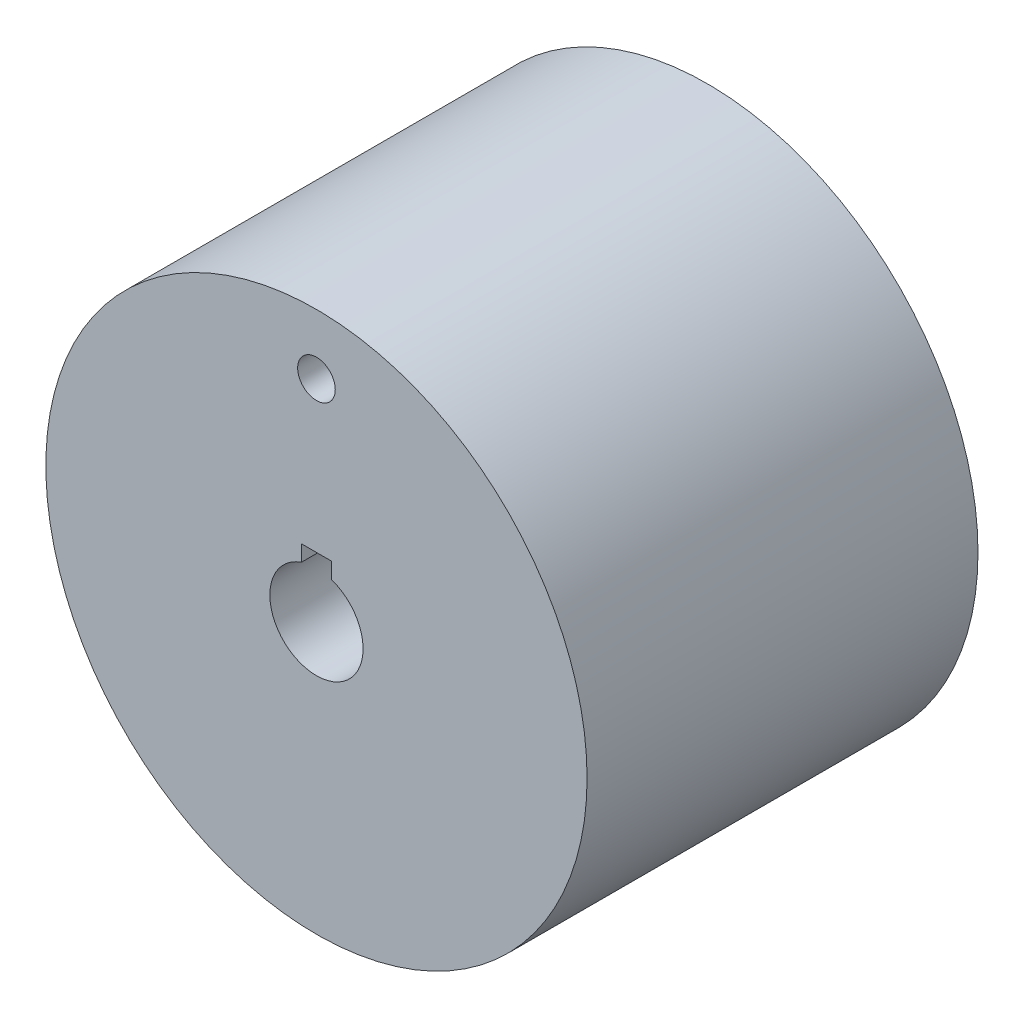
ISO-10303-21;
HEADER;
FILE_DESCRIPTION(('STEP AP214'),'2;1');
FILE_NAME('part.step','',(''),(''),'','','');
FILE_SCHEMA(('AUTOMOTIVE_DESIGN { 1 0 10303 214 1 1 1 1 }'));
ENDSEC;
DATA;
#1=APPLICATION_CONTEXT('core data for automotive mechanical design processes');
#2=APPLICATION_PROTOCOL_DEFINITION('international standard','automotive_design',2000,#1);
#3=PRODUCT_CONTEXT('',#1,'mechanical');
#4=PRODUCT('Part','Part','',(#3));
#5=PRODUCT_RELATED_PRODUCT_CATEGORY('part','',(#4));
#6=PRODUCT_DEFINITION_FORMATION('','',#4);
#7=PRODUCT_DEFINITION_CONTEXT('part definition',#1,'design');
#8=PRODUCT_DEFINITION('design','',#6,#7);
#9=PRODUCT_DEFINITION_SHAPE('','',#8);
#10=(LENGTH_UNIT() NAMED_UNIT(*) SI_UNIT(.MILLI.,.METRE.));
#11=(NAMED_UNIT(*) PLANE_ANGLE_UNIT() SI_UNIT($,.RADIAN.));
#12=(NAMED_UNIT(*) SI_UNIT($,.STERADIAN.) SOLID_ANGLE_UNIT());
#13=UNCERTAINTY_MEASURE_WITH_UNIT(LENGTH_MEASURE(1.E-05),#10,'distance_accuracy_value','');
#14=(GEOMETRIC_REPRESENTATION_CONTEXT(3) GLOBAL_UNCERTAINTY_ASSIGNED_CONTEXT((#13)) GLOBAL_UNIT_ASSIGNED_CONTEXT((#10,
#11,#12)) REPRESENTATION_CONTEXT('',''));
#15=CARTESIAN_POINT('',(0.,0.,0.));
#16=DIRECTION('',(0.,0.,1.));
#17=DIRECTION('',(1.,0.,0.));
#18=AXIS2_PLACEMENT_3D('',#15,#16,#17);
#19=CARTESIAN_POINT('',(0.,0.,13.));
#20=DIRECTION('',(0.,0.,1.));
#21=DIRECTION('',(1.,0.,0.));
#22=AXIS2_PLACEMENT_3D('',#19,#20,#21);
#23=PLANE('',#22);
#24=DIRECTION('',(0.,1.,0.));
#25=VECTOR('',#24,1.);
#26=CARTESIAN_POINT('',(1.,4.,13.));
#27=LINE('',#26,#25);
#28=CARTESIAN_POINT('',(1.,2.93428015022424,13.));
#29=VERTEX_POINT('',#28);
#30=CARTESIAN_POINT('',(1.,4.,13.));
#31=VERTEX_POINT('',#30);
#32=EDGE_CURVE('E100',#29,#31,#27,.T.);
#33=ORIENTED_EDGE('',*,*,#32,.F.);
#34=CARTESIAN_POINT('',(0.,0.,13.));
#35=DIRECTION('',(0.,0.,1.));
#36=DIRECTION('',(-1.,0.,0.));
#37=AXIS2_PLACEMENT_3D('',#34,#35,#36);
#38=CIRCLE('',#37,3.1);
#39=CARTESIAN_POINT('',(-1.,2.93428015022424,13.));
#40=VERTEX_POINT('',#39);
#41=EDGE_CURVE('E90',#40,#29,#38,.T.);
#42=ORIENTED_EDGE('',*,*,#41,.F.);
#43=DIRECTION('',(0.,-1.,0.));
#44=VECTOR('',#43,1.);
#45=CARTESIAN_POINT('',(-1.,2.93428015022424,13.));
#46=LINE('',#45,#44);
#47=CARTESIAN_POINT('',(-1.,4.,13.));
#48=VERTEX_POINT('',#47);
#49=EDGE_CURVE('E112',#48,#40,#46,.T.);
#50=ORIENTED_EDGE('',*,*,#49,.F.);
#51=DIRECTION('',(-1.,0.,0.));
#52=VECTOR('',#51,1.);
#53=CARTESIAN_POINT('',(-1.,4.,13.));
#54=LINE('',#53,#52);
#55=EDGE_CURVE('E108',#31,#48,#54,.T.);
#56=ORIENTED_EDGE('',*,*,#55,.F.);
#57=EDGE_LOOP('',(#33,#42,#50,#56));
#58=FACE_BOUND('',#57,.T.);
#59=CARTESIAN_POINT('',(0.,0.,13.));
#60=DIRECTION('',(0.,0.,1.));
#61=DIRECTION('',(1.,0.,0.));
#62=AXIS2_PLACEMENT_3D('',#59,#60,#61);
#63=CIRCLE('',#62,18.);
#64=CARTESIAN_POINT('',(18.,0.,13.));
#65=VERTEX_POINT('',#64);
#66=EDGE_CURVE('E11',#65,#65,#63,.T.);
#67=ORIENTED_EDGE('',*,*,#66,.T.);
#68=EDGE_LOOP('',(#67));
#69=FACE_BOUND('',#68,.T.);
#70=CARTESIAN_POINT('',(0.,14.,13.));
#71=DIRECTION('',(0.,0.,1.));
#72=DIRECTION('',(1.,0.,0.));
#73=AXIS2_PLACEMENT_3D('',#70,#71,#72);
#74=CIRCLE('',#73,1.25);
#75=CARTESIAN_POINT('',(1.25,14.,13.));
#76=VERTEX_POINT('',#75);
#77=EDGE_CURVE('E120',#76,#76,#74,.T.);
#78=ORIENTED_EDGE('',*,*,#77,.F.);
#79=EDGE_LOOP('',(#78));
#80=FACE_BOUND('',#79,.T.);
#81=ADVANCED_FACE('F50',(#58,#69,#80),#23,.T.);
#82=CARTESIAN_POINT('',(0.,0.,-13.));
#83=DIRECTION('',(0.,0.,1.));
#84=DIRECTION('',(1.,0.,0.));
#85=AXIS2_PLACEMENT_3D('',#82,#83,#84);
#86=PLANE('',#85);
#87=CARTESIAN_POINT('',(0.,0.,-13.));
#88=DIRECTION('',(0.,0.,1.));
#89=DIRECTION('',(1.,0.,0.));
#90=AXIS2_PLACEMENT_3D('',#87,#88,#89);
#91=CIRCLE('',#90,18.);
#92=CARTESIAN_POINT('',(18.,0.,-13.));
#93=VERTEX_POINT('',#92);
#94=EDGE_CURVE('E55',#93,#93,#91,.T.);
#95=ORIENTED_EDGE('',*,*,#94,.F.);
#96=EDGE_LOOP('',(#95));
#97=FACE_BOUND('',#96,.T.);
#98=CARTESIAN_POINT('',(0.,0.,-13.));
#99=DIRECTION('',(0.,0.,1.));
#100=DIRECTION('',(-1.,0.,0.));
#101=AXIS2_PLACEMENT_3D('',#98,#99,#100);
#102=CIRCLE('',#101,3.1);
#103=CARTESIAN_POINT('',(-1.,2.93428015022424,-13.));
#104=VERTEX_POINT('',#103);
#105=CARTESIAN_POINT('',(1.,2.93428015022424,-13.));
#106=VERTEX_POINT('',#105);
#107=EDGE_CURVE('E72',#104,#106,#102,.T.);
#108=ORIENTED_EDGE('',*,*,#107,.T.);
#109=DIRECTION('',(0.,1.,0.));
#110=VECTOR('',#109,1.);
#111=CARTESIAN_POINT('',(1.,4.,-13.));
#112=LINE('',#111,#110);
#113=CARTESIAN_POINT('',(1.,4.,-13.));
#114=VERTEX_POINT('',#113);
#115=EDGE_CURVE('E102',#106,#114,#112,.T.);
#116=ORIENTED_EDGE('',*,*,#115,.T.);
#117=DIRECTION('',(-1.,0.,0.));
#118=VECTOR('',#117,1.);
#119=CARTESIAN_POINT('',(-1.,4.,-13.));
#120=LINE('',#119,#118);
#121=CARTESIAN_POINT('',(-1.,4.,-13.));
#122=VERTEX_POINT('',#121);
#123=EDGE_CURVE('E119',#114,#122,#120,.T.);
#124=ORIENTED_EDGE('',*,*,#123,.T.);
#125=DIRECTION('',(0.,-1.,0.));
#126=VECTOR('',#125,1.);
#127=CARTESIAN_POINT('',(-1.,2.93428015022424,-13.));
#128=LINE('',#127,#126);
#129=EDGE_CURVE('E98',#122,#104,#128,.T.);
#130=ORIENTED_EDGE('',*,*,#129,.T.);
#131=EDGE_LOOP('',(#108,#116,#124,#130));
#132=FACE_BOUND('',#131,.T.);
#133=CARTESIAN_POINT('',(0.,14.,-13.));
#134=DIRECTION('',(0.,0.,1.));
#135=DIRECTION('',(1.,0.,0.));
#136=AXIS2_PLACEMENT_3D('',#133,#134,#135);
#137=CIRCLE('',#136,1.25);
#138=CARTESIAN_POINT('',(1.25,14.,-13.));
#139=VERTEX_POINT('',#138);
#140=EDGE_CURVE('E168',#139,#139,#137,.T.);
#141=ORIENTED_EDGE('',*,*,#140,.T.);
#142=EDGE_LOOP('',(#141));
#143=FACE_BOUND('',#142,.T.);
#144=ADVANCED_FACE('F128',(#97,#132,#143),#86,.F.);
#145=CARTESIAN_POINT('',(0.,0.,13.));
#146=DIRECTION('',(0.,0.,-1.));
#147=DIRECTION('',(-1.,0.,0.));
#148=AXIS2_PLACEMENT_3D('',#145,#146,#147);
#149=CYLINDRICAL_SURFACE('',#148,18.);
#150=ORIENTED_EDGE('',*,*,#66,.F.);
#151=EDGE_LOOP('',(#150));
#152=FACE_BOUND('',#151,.T.);
#153=ORIENTED_EDGE('',*,*,#94,.T.);
#154=EDGE_LOOP('',(#153));
#155=FACE_BOUND('',#154,.T.);
#156=ADVANCED_FACE('F49',(#152,#155),#149,.T.);
#157=CARTESIAN_POINT('',(0.,0.,13.));
#158=DIRECTION('',(0.,0.,-1.));
#159=DIRECTION('',(-1.,0.,0.));
#160=AXIS2_PLACEMENT_3D('',#157,#158,#159);
#161=CYLINDRICAL_SURFACE('',#160,3.1);
#162=ORIENTED_EDGE('',*,*,#107,.F.);
#163=DIRECTION('',(0.,0.,-1.));
#164=VECTOR('',#163,1.);
#165=CARTESIAN_POINT('',(-1.,2.93428015022424,13.));
#166=LINE('',#165,#164);
#167=EDGE_CURVE('E91',#40,#104,#166,.T.);
#168=ORIENTED_EDGE('',*,*,#167,.F.);
#169=ORIENTED_EDGE('',*,*,#41,.T.);
#170=DIRECTION('',(0.,0.,-1.));
#171=VECTOR('',#170,1.);
#172=CARTESIAN_POINT('',(1.,2.93428015022424,13.));
#173=LINE('',#172,#171);
#174=EDGE_CURVE('E95',#29,#106,#173,.T.);
#175=ORIENTED_EDGE('',*,*,#174,.T.);
#176=EDGE_LOOP('',(#162,#168,#169,#175));
#177=FACE_BOUND('',#176,.T.);
#178=ADVANCED_FACE('F93',(#177),#161,.F.);
#179=CARTESIAN_POINT('',(1.,4.,13.));
#180=DIRECTION('',(-1.,0.,0.));
#181=DIRECTION('',(0.,0.,1.));
#182=AXIS2_PLACEMENT_3D('',#179,#180,#181);
#183=PLANE('',#182);
#184=ORIENTED_EDGE('',*,*,#115,.F.);
#185=ORIENTED_EDGE('',*,*,#174,.F.);
#186=ORIENTED_EDGE('',*,*,#32,.T.);
#187=DIRECTION('',(0.,0.,-1.));
#188=VECTOR('',#187,1.);
#189=CARTESIAN_POINT('',(1.,4.,13.));
#190=LINE('',#189,#188);
#191=EDGE_CURVE('E104',#31,#114,#190,.T.);
#192=ORIENTED_EDGE('',*,*,#191,.T.);
#193=EDGE_LOOP('',(#184,#185,#186,#192));
#194=FACE_BOUND('',#193,.T.);
#195=ADVANCED_FACE('F101',(#194),#183,.T.);
#196=CARTESIAN_POINT('',(-1.,4.,13.));
#197=DIRECTION('',(0.,-1.,0.));
#198=DIRECTION('',(0.,0.,-1.));
#199=AXIS2_PLACEMENT_3D('',#196,#197,#198);
#200=PLANE('',#199);
#201=ORIENTED_EDGE('',*,*,#123,.F.);
#202=ORIENTED_EDGE('',*,*,#191,.F.);
#203=ORIENTED_EDGE('',*,*,#55,.T.);
#204=DIRECTION('',(0.,0.,-1.));
#205=VECTOR('',#204,1.);
#206=CARTESIAN_POINT('',(-1.,4.,13.));
#207=LINE('',#206,#205);
#208=EDGE_CURVE('E61',#48,#122,#207,.T.);
#209=ORIENTED_EDGE('',*,*,#208,.T.);
#210=EDGE_LOOP('',(#201,#202,#203,#209));
#211=FACE_BOUND('',#210,.T.);
#212=ADVANCED_FACE('F126',(#211),#200,.T.);
#213=CARTESIAN_POINT('',(-1.,2.93428015022424,13.));
#214=DIRECTION('',(1.,0.,0.));
#215=DIRECTION('',(0.,0.,-1.));
#216=AXIS2_PLACEMENT_3D('',#213,#214,#215);
#217=PLANE('',#216);
#218=ORIENTED_EDGE('',*,*,#129,.F.);
#219=ORIENTED_EDGE('',*,*,#208,.F.);
#220=ORIENTED_EDGE('',*,*,#49,.T.);
#221=ORIENTED_EDGE('',*,*,#167,.T.);
#222=EDGE_LOOP('',(#218,#219,#220,#221));
#223=FACE_BOUND('',#222,.T.);
#224=ADVANCED_FACE('F135',(#223),#217,.T.);
#225=CARTESIAN_POINT('',(0.,14.,13.));
#226=DIRECTION('',(0.,0.,-1.));
#227=DIRECTION('',(-1.,0.,0.));
#228=AXIS2_PLACEMENT_3D('',#225,#226,#227);
#229=CYLINDRICAL_SURFACE('',#228,1.25);
#230=ORIENTED_EDGE('',*,*,#77,.T.);
#231=EDGE_LOOP('',(#230));
#232=FACE_BOUND('',#231,.T.);
#233=ORIENTED_EDGE('',*,*,#140,.F.);
#234=EDGE_LOOP('',(#233));
#235=FACE_BOUND('',#234,.T.);
#236=ADVANCED_FACE('F134',(#232,#235),#229,.F.);
#237=CLOSED_SHELL('',(#81,#144,#156,#178,#195,#212,#224,#236));
#238=MANIFOLD_SOLID_BREP('B2',#237);
#239=ADVANCED_BREP_SHAPE_REPRESENTATION('',(#18,#238),#14);
#240=SHAPE_DEFINITION_REPRESENTATION(#9,#239);
ENDSEC;
END-ISO-10303-21;
